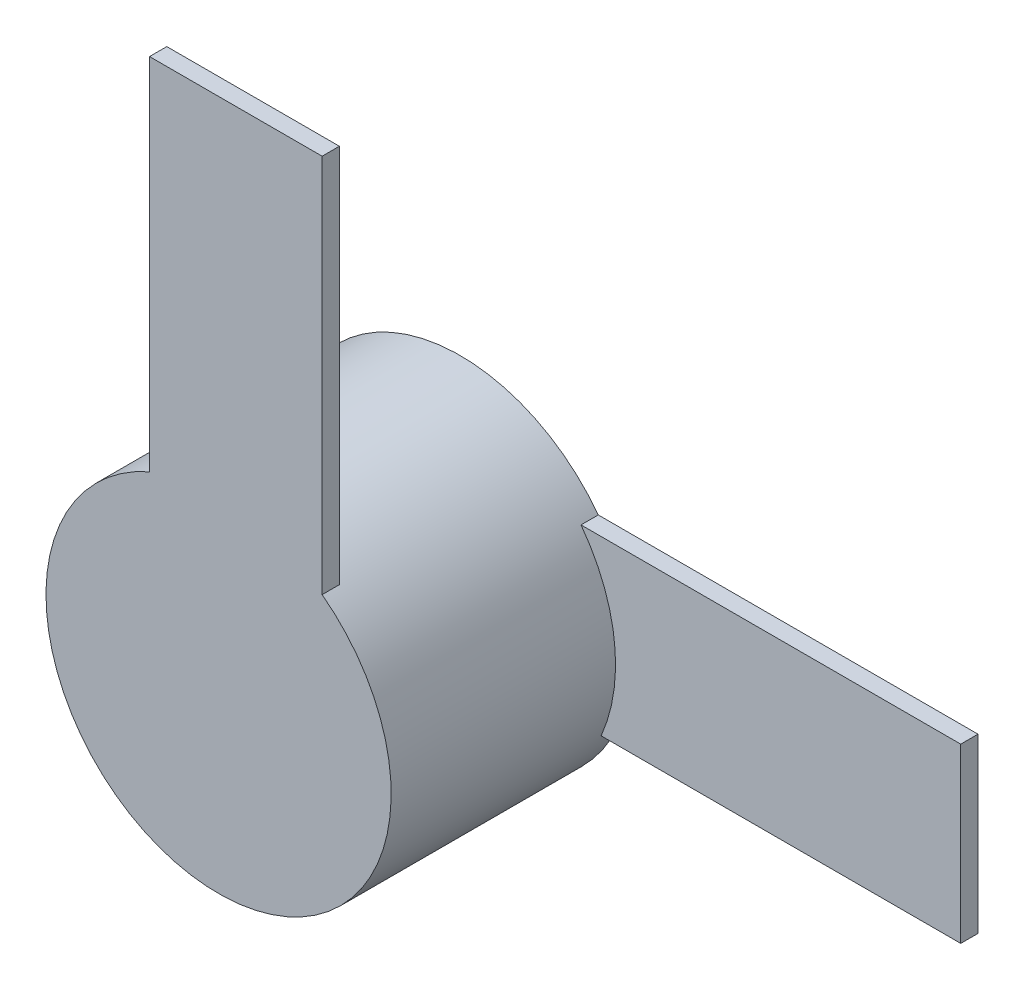
ISO-10303-21;
HEADER;
FILE_DESCRIPTION(('STEP AP214'),'2;1');
FILE_NAME('part.step','',(''),(''),'','','');
FILE_SCHEMA(('AUTOMOTIVE_DESIGN { 1 0 10303 214 1 1 1 1 }'));
ENDSEC;
DATA;
#1=APPLICATION_CONTEXT('core data for automotive mechanical design processes');
#2=APPLICATION_PROTOCOL_DEFINITION('international standard','automotive_design',2000,#1);
#3=PRODUCT_CONTEXT('',#1,'mechanical');
#4=PRODUCT('Part','Part','',(#3));
#5=PRODUCT_RELATED_PRODUCT_CATEGORY('part','',(#4));
#6=PRODUCT_DEFINITION_FORMATION('','',#4);
#7=PRODUCT_DEFINITION_CONTEXT('part definition',#1,'design');
#8=PRODUCT_DEFINITION('design','',#6,#7);
#9=PRODUCT_DEFINITION_SHAPE('','',#8);
#10=(LENGTH_UNIT() NAMED_UNIT(*) SI_UNIT(.MILLI.,.METRE.));
#11=(NAMED_UNIT(*) PLANE_ANGLE_UNIT() SI_UNIT($,.RADIAN.));
#12=(NAMED_UNIT(*) SI_UNIT($,.STERADIAN.) SOLID_ANGLE_UNIT());
#13=UNCERTAINTY_MEASURE_WITH_UNIT(LENGTH_MEASURE(1.E-05),#10,'distance_accuracy_value','');
#14=(GEOMETRIC_REPRESENTATION_CONTEXT(3) GLOBAL_UNCERTAINTY_ASSIGNED_CONTEXT((#13)) GLOBAL_UNIT_ASSIGNED_CONTEXT((#10,
#11,#12)) REPRESENTATION_CONTEXT('',''));
#15=CARTESIAN_POINT('',(0.,0.,0.));
#16=DIRECTION('',(0.,0.,1.));
#17=DIRECTION('',(1.,0.,0.));
#18=AXIS2_PLACEMENT_3D('',#15,#16,#17);
#19=CARTESIAN_POINT('',(0.,0.,70.));
#20=DIRECTION('',(0.,0.,-1.));
#21=DIRECTION('',(-1.,0.,0.));
#22=AXIS2_PLACEMENT_3D('',#19,#20,#21);
#23=CYLINDRICAL_SURFACE('',#22,50.);
#24=DIRECTION('',(0.,0.,-1.));
#25=VECTOR('',#24,1.);
#26=CARTESIAN_POINT('',(-20.,45.8257569495584,70.));
#27=LINE('',#26,#25);
#28=CARTESIAN_POINT('',(-20.,45.8257569495584,65.));
#29=VERTEX_POINT('',#28);
#30=CARTESIAN_POINT('',(-20.,45.8257569495584,70.));
#31=VERTEX_POINT('',#30);
#32=EDGE_CURVE('E154',#29,#31,#27,.F.);
#33=ORIENTED_EDGE('',*,*,#32,.F.);
#34=CARTESIAN_POINT('',(0.,0.,65.));
#35=DIRECTION('',(0.,0.,1.));
#36=DIRECTION('',(1.,0.,0.));
#37=AXIS2_PLACEMENT_3D('',#34,#35,#36);
#38=CIRCLE('',#37,50.);
#39=CARTESIAN_POINT('',(30.,40.,65.));
#40=VERTEX_POINT('',#39);
#41=EDGE_CURVE('E46',#40,#29,#38,.T.);
#42=ORIENTED_EDGE('',*,*,#41,.F.);
#43=DIRECTION('',(0.,0.,-1.));
#44=VECTOR('',#43,1.);
#45=CARTESIAN_POINT('',(30.,40.,70.));
#46=LINE('',#45,#44);
#47=CARTESIAN_POINT('',(30.,40.,70.));
#48=VERTEX_POINT('',#47);
#49=EDGE_CURVE('E151',#48,#40,#46,.T.);
#50=ORIENTED_EDGE('',*,*,#49,.F.);
#51=CARTESIAN_POINT('',(0.,0.,70.));
#52=DIRECTION('',(0.,0.,1.));
#53=DIRECTION('',(1.,0.,0.));
#54=AXIS2_PLACEMENT_3D('',#51,#52,#53);
#55=CIRCLE('',#54,50.);
#56=EDGE_CURVE('E157',#31,#48,#55,.T.);
#57=ORIENTED_EDGE('',*,*,#56,.F.);
#58=EDGE_LOOP('',(#33,#42,#50,#57));
#59=FACE_BOUND('',#58,.T.);
#60=DIRECTION('',(0.,0.,-1.));
#61=VECTOR('',#60,1.);
#62=CARTESIAN_POINT('',(40.,30.,70.));
#63=LINE('',#62,#61);
#64=CARTESIAN_POINT('',(40.,30.,0.));
#65=VERTEX_POINT('',#64);
#66=CARTESIAN_POINT('',(40.,30.,5.));
#67=VERTEX_POINT('',#66);
#68=EDGE_CURVE('E123',#65,#67,#63,.F.);
#69=ORIENTED_EDGE('',*,*,#68,.F.);
#70=CARTESIAN_POINT('',(0.,0.,0.));
#71=DIRECTION('',(0.,0.,1.));
#72=DIRECTION('',(1.,0.,0.));
#73=AXIS2_PLACEMENT_3D('',#70,#71,#72);
#74=CIRCLE('',#73,50.);
#75=CARTESIAN_POINT('',(45.8257569495584,-20.,0.));
#76=VERTEX_POINT('',#75);
#77=EDGE_CURVE('E121',#65,#76,#74,.T.);
#78=ORIENTED_EDGE('',*,*,#77,.T.);
#79=DIRECTION('',(0.,0.,-1.));
#80=VECTOR('',#79,1.);
#81=CARTESIAN_POINT('',(45.8257569495584,-20.,70.));
#82=LINE('',#81,#80);
#83=CARTESIAN_POINT('',(45.8257569495584,-20.,5.));
#84=VERTEX_POINT('',#83);
#85=EDGE_CURVE('E56',#84,#76,#82,.T.);
#86=ORIENTED_EDGE('',*,*,#85,.F.);
#87=CARTESIAN_POINT('',(0.,0.,5.));
#88=DIRECTION('',(0.,0.,-1.));
#89=DIRECTION('',(-1.,0.,0.));
#90=AXIS2_PLACEMENT_3D('',#87,#88,#89);
#91=CIRCLE('',#90,50.);
#92=EDGE_CURVE('E11',#67,#84,#91,.T.);
#93=ORIENTED_EDGE('',*,*,#92,.F.);
#94=EDGE_LOOP('',(#69,#78,#86,#93));
#95=FACE_BOUND('',#94,.T.);
#96=ADVANCED_FACE('F39',(#59,#95),#23,.T.);
#97=CARTESIAN_POINT('',(0.,0.,70.));
#98=DIRECTION('',(0.,0.,1.));
#99=DIRECTION('',(1.,0.,0.));
#100=AXIS2_PLACEMENT_3D('',#97,#98,#99);
#101=PLANE('',#100);
#102=ORIENTED_EDGE('',*,*,#56,.T.);
#103=DIRECTION('',(0.,-1.,0.));
#104=VECTOR('',#103,1.);
#105=CARTESIAN_POINT('',(30.,150.,70.));
#106=LINE('',#105,#104);
#107=CARTESIAN_POINT('',(30.,150.,70.));
#108=VERTEX_POINT('',#107);
#109=EDGE_CURVE('E145',#108,#48,#106,.T.);
#110=ORIENTED_EDGE('',*,*,#109,.F.);
#111=DIRECTION('',(1.,0.,0.));
#112=VECTOR('',#111,1.);
#113=CARTESIAN_POINT('',(-20.,150.,70.));
#114=LINE('',#113,#112);
#115=CARTESIAN_POINT('',(-20.,150.,70.));
#116=VERTEX_POINT('',#115);
#117=EDGE_CURVE('E133',#116,#108,#114,.T.);
#118=ORIENTED_EDGE('',*,*,#117,.F.);
#119=DIRECTION('',(0.,-1.,0.));
#120=VECTOR('',#119,1.);
#121=CARTESIAN_POINT('',(-20.,150.,70.));
#122=LINE('',#121,#120);
#123=EDGE_CURVE('E148',#116,#31,#122,.T.);
#124=ORIENTED_EDGE('',*,*,#123,.T.);
#125=EDGE_LOOP('',(#102,#110,#118,#124));
#126=FACE_BOUND('',#125,.T.);
#127=ADVANCED_FACE('F178',(#126),#101,.T.);
#128=CARTESIAN_POINT('',(0.,0.,0.));
#129=DIRECTION('',(0.,0.,1.));
#130=DIRECTION('',(1.,0.,0.));
#131=AXIS2_PLACEMENT_3D('',#128,#129,#130);
#132=PLANE('',#131);
#133=ORIENTED_EDGE('',*,*,#77,.F.);
#134=DIRECTION('',(-1.,0.,0.));
#135=VECTOR('',#134,1.);
#136=CARTESIAN_POINT('',(150.,30.,0.));
#137=LINE('',#136,#135);
#138=CARTESIAN_POINT('',(150.,30.,0.));
#139=VERTEX_POINT('',#138);
#140=EDGE_CURVE('E103',#139,#65,#137,.T.);
#141=ORIENTED_EDGE('',*,*,#140,.F.);
#142=DIRECTION('',(0.,1.,0.));
#143=VECTOR('',#142,1.);
#144=CARTESIAN_POINT('',(150.,30.,0.));
#145=LINE('',#144,#143);
#146=CARTESIAN_POINT('',(150.,-20.,0.));
#147=VERTEX_POINT('',#146);
#148=EDGE_CURVE('E109',#147,#139,#145,.T.);
#149=ORIENTED_EDGE('',*,*,#148,.F.);
#150=DIRECTION('',(-1.,0.,0.));
#151=VECTOR('',#150,1.);
#152=CARTESIAN_POINT('',(150.,-20.,0.));
#153=LINE('',#152,#151);
#154=EDGE_CURVE('E283',#147,#76,#153,.T.);
#155=ORIENTED_EDGE('',*,*,#154,.T.);
#156=EDGE_LOOP('',(#133,#141,#149,#155));
#157=FACE_BOUND('',#156,.T.);
#158=ADVANCED_FACE('F120',(#157),#132,.F.);
#159=CARTESIAN_POINT('',(-20.,150.,70.));
#160=DIRECTION('',(1.,0.,0.));
#161=DIRECTION('',(0.,0.,-1.));
#162=AXIS2_PLACEMENT_3D('',#159,#160,#161);
#163=PLANE('',#162);
#164=DIRECTION('',(0.,-1.,0.));
#165=VECTOR('',#164,1.);
#166=CARTESIAN_POINT('',(-20.,150.,65.));
#167=LINE('',#166,#165);
#168=CARTESIAN_POINT('',(-20.,150.,65.));
#169=VERTEX_POINT('',#168);
#170=EDGE_CURVE('E139',#169,#29,#167,.T.);
#171=ORIENTED_EDGE('',*,*,#170,.T.);
#172=ORIENTED_EDGE('',*,*,#32,.T.);
#173=ORIENTED_EDGE('',*,*,#123,.F.);
#174=DIRECTION('',(0.,0.,1.));
#175=VECTOR('',#174,1.);
#176=CARTESIAN_POINT('',(-20.,150.,70.));
#177=LINE('',#176,#175);
#178=EDGE_CURVE('E130',#169,#116,#177,.T.);
#179=ORIENTED_EDGE('',*,*,#178,.F.);
#180=EDGE_LOOP('',(#171,#172,#173,#179));
#181=FACE_BOUND('',#180,.T.);
#182=ADVANCED_FACE('F169',(#181),#163,.F.);
#183=CARTESIAN_POINT('',(30.,150.,70.));
#184=DIRECTION('',(-1.,0.,0.));
#185=DIRECTION('',(0.,0.,1.));
#186=AXIS2_PLACEMENT_3D('',#183,#184,#185);
#187=PLANE('',#186);
#188=ORIENTED_EDGE('',*,*,#109,.T.);
#189=ORIENTED_EDGE('',*,*,#49,.T.);
#190=DIRECTION('',(0.,-1.,0.));
#191=VECTOR('',#190,1.);
#192=CARTESIAN_POINT('',(30.,150.,65.));
#193=LINE('',#192,#191);
#194=CARTESIAN_POINT('',(30.,150.,65.));
#195=VERTEX_POINT('',#194);
#196=EDGE_CURVE('E142',#195,#40,#193,.T.);
#197=ORIENTED_EDGE('',*,*,#196,.F.);
#198=DIRECTION('',(0.,0.,-1.));
#199=VECTOR('',#198,1.);
#200=CARTESIAN_POINT('',(30.,150.,70.));
#201=LINE('',#200,#199);
#202=EDGE_CURVE('E135',#108,#195,#201,.T.);
#203=ORIENTED_EDGE('',*,*,#202,.F.);
#204=EDGE_LOOP('',(#188,#189,#197,#203));
#205=FACE_BOUND('',#204,.T.);
#206=ADVANCED_FACE('F176',(#205),#187,.F.);
#207=CARTESIAN_POINT('',(-20.,150.,65.));
#208=DIRECTION('',(0.,0.,1.));
#209=DIRECTION('',(1.,0.,0.));
#210=AXIS2_PLACEMENT_3D('',#207,#208,#209);
#211=PLANE('',#210);
#212=ORIENTED_EDGE('',*,*,#196,.T.);
#213=ORIENTED_EDGE('',*,*,#41,.T.);
#214=ORIENTED_EDGE('',*,*,#170,.F.);
#215=DIRECTION('',(-1.,0.,0.));
#216=VECTOR('',#215,1.);
#217=CARTESIAN_POINT('',(-20.,150.,65.));
#218=LINE('',#217,#216);
#219=EDGE_CURVE('E137',#195,#169,#218,.T.);
#220=ORIENTED_EDGE('',*,*,#219,.F.);
#221=EDGE_LOOP('',(#212,#213,#214,#220));
#222=FACE_BOUND('',#221,.T.);
#223=ADVANCED_FACE('F163',(#222),#211,.F.);
#224=CARTESIAN_POINT('',(0.,150.,0.));
#225=DIRECTION('',(0.,-1.,0.));
#226=DIRECTION('',(0.,0.,-1.));
#227=AXIS2_PLACEMENT_3D('',#224,#225,#226);
#228=PLANE('',#227);
#229=ORIENTED_EDGE('',*,*,#178,.T.);
#230=ORIENTED_EDGE('',*,*,#117,.T.);
#231=ORIENTED_EDGE('',*,*,#202,.T.);
#232=ORIENTED_EDGE('',*,*,#219,.T.);
#233=EDGE_LOOP('',(#229,#230,#231,#232));
#234=FACE_BOUND('',#233,.T.);
#235=ADVANCED_FACE('F172',(#234),#228,.F.);
#236=CARTESIAN_POINT('',(150.,30.,0.));
#237=DIRECTION('',(0.,-1.,0.));
#238=DIRECTION('',(0.,0.,-1.));
#239=AXIS2_PLACEMENT_3D('',#236,#237,#238);
#240=PLANE('',#239);
#241=ORIENTED_EDGE('',*,*,#140,.T.);
#242=ORIENTED_EDGE('',*,*,#68,.T.);
#243=DIRECTION('',(-1.,0.,0.));
#244=VECTOR('',#243,1.);
#245=CARTESIAN_POINT('',(150.,30.,5.));
#246=LINE('',#245,#244);
#247=CARTESIAN_POINT('',(150.,30.,5.));
#248=VERTEX_POINT('',#247);
#249=EDGE_CURVE('E105',#248,#67,#246,.T.);
#250=ORIENTED_EDGE('',*,*,#249,.F.);
#251=DIRECTION('',(0.,0.,1.));
#252=VECTOR('',#251,1.);
#253=CARTESIAN_POINT('',(150.,30.,0.));
#254=LINE('',#253,#252);
#255=EDGE_CURVE('E99',#139,#248,#254,.T.);
#256=ORIENTED_EDGE('',*,*,#255,.F.);
#257=EDGE_LOOP('',(#241,#242,#250,#256));
#258=FACE_BOUND('',#257,.T.);
#259=ADVANCED_FACE('F101',(#258),#240,.F.);
#260=CARTESIAN_POINT('',(150.,-20.,0.));
#261=DIRECTION('',(0.,1.,0.));
#262=DIRECTION('',(0.,0.,1.));
#263=AXIS2_PLACEMENT_3D('',#260,#261,#262);
#264=PLANE('',#263);
#265=DIRECTION('',(-1.,0.,0.));
#266=VECTOR('',#265,1.);
#267=CARTESIAN_POINT('',(150.,-20.,5.));
#268=LINE('',#267,#266);
#269=CARTESIAN_POINT('',(150.,-20.,5.));
#270=VERTEX_POINT('',#269);
#271=EDGE_CURVE('E125',#270,#84,#268,.T.);
#272=ORIENTED_EDGE('',*,*,#271,.T.);
#273=ORIENTED_EDGE('',*,*,#85,.T.);
#274=ORIENTED_EDGE('',*,*,#154,.F.);
#275=DIRECTION('',(0.,0.,-1.));
#276=VECTOR('',#275,1.);
#277=CARTESIAN_POINT('',(150.,-20.,0.));
#278=LINE('',#277,#276);
#279=EDGE_CURVE('E114',#270,#147,#278,.T.);
#280=ORIENTED_EDGE('',*,*,#279,.F.);
#281=EDGE_LOOP('',(#272,#273,#274,#280));
#282=FACE_BOUND('',#281,.T.);
#283=ADVANCED_FACE('F196',(#282),#264,.F.);
#284=CARTESIAN_POINT('',(150.,30.,5.));
#285=DIRECTION('',(0.,0.,-1.));
#286=DIRECTION('',(-1.,0.,0.));
#287=AXIS2_PLACEMENT_3D('',#284,#285,#286);
#288=PLANE('',#287);
#289=ORIENTED_EDGE('',*,*,#249,.T.);
#290=ORIENTED_EDGE('',*,*,#92,.T.);
#291=ORIENTED_EDGE('',*,*,#271,.F.);
#292=DIRECTION('',(0.,-1.,0.));
#293=VECTOR('',#292,1.);
#294=CARTESIAN_POINT('',(150.,30.,5.));
#295=LINE('',#294,#293);
#296=EDGE_CURVE('E108',#248,#270,#295,.T.);
#297=ORIENTED_EDGE('',*,*,#296,.F.);
#298=EDGE_LOOP('',(#289,#290,#291,#297));
#299=FACE_BOUND('',#298,.T.);
#300=ADVANCED_FACE('F197',(#299),#288,.F.);
#301=CARTESIAN_POINT('',(150.,0.,0.));
#302=DIRECTION('',(-1.,0.,0.));
#303=DIRECTION('',(0.,0.,1.));
#304=AXIS2_PLACEMENT_3D('',#301,#302,#303);
#305=PLANE('',#304);
#306=ORIENTED_EDGE('',*,*,#148,.T.);
#307=ORIENTED_EDGE('',*,*,#255,.T.);
#308=ORIENTED_EDGE('',*,*,#296,.T.);
#309=ORIENTED_EDGE('',*,*,#279,.T.);
#310=EDGE_LOOP('',(#306,#307,#308,#309));
#311=FACE_BOUND('',#310,.T.);
#312=ADVANCED_FACE('F112',(#311),#305,.F.);
#313=CLOSED_SHELL('',(#96,#127,#158,#182,#206,#223,#235,#259,#283,#300,#312));
#314=MANIFOLD_SOLID_BREP('B2',#313);
#315=ADVANCED_BREP_SHAPE_REPRESENTATION('',(#18,#314),#14);
#316=SHAPE_DEFINITION_REPRESENTATION(#9,#315);
ENDSEC;
END-ISO-10303-21;
